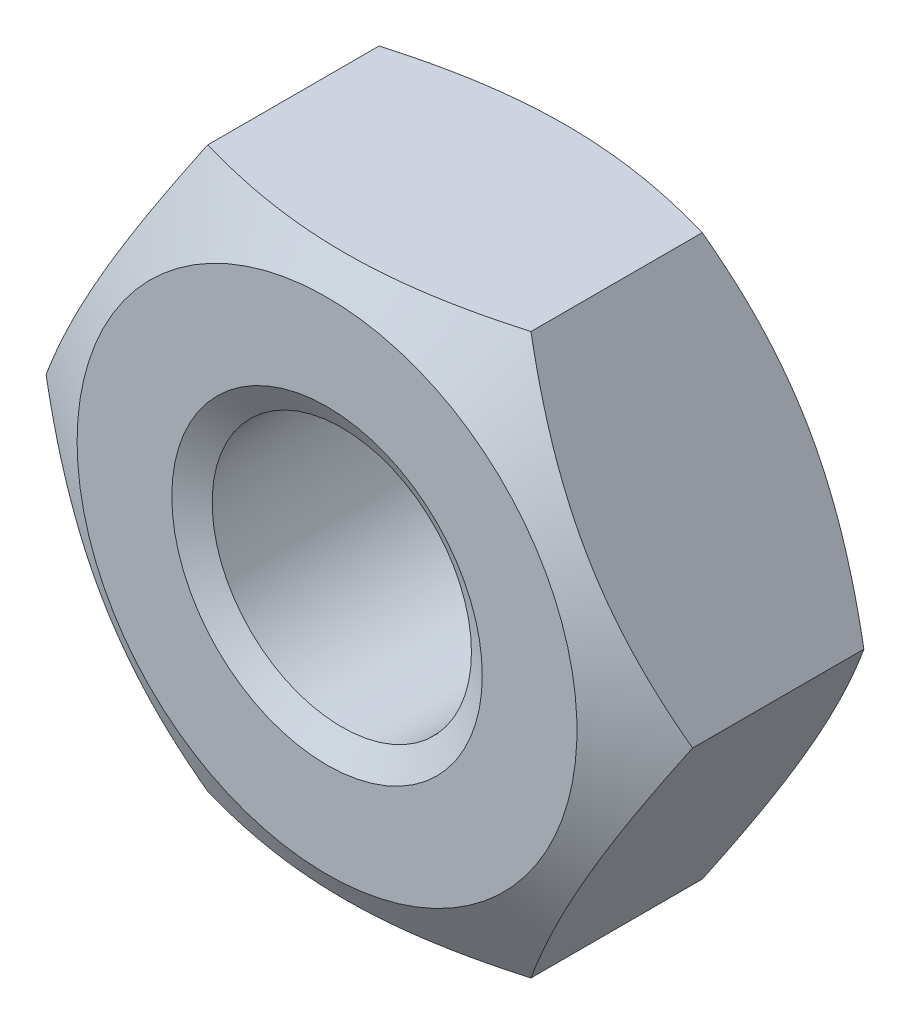
ISO-10303-21;
HEADER;
FILE_DESCRIPTION(('STEP AP214'),'2;1');
FILE_NAME('part.step','',(''),(''),'','','');
FILE_SCHEMA(('AUTOMOTIVE_DESIGN { 1 0 10303 214 1 1 1 1 }'));
ENDSEC;
DATA;
#1=APPLICATION_CONTEXT('core data for automotive mechanical design processes');
#2=APPLICATION_PROTOCOL_DEFINITION('international standard','automotive_design',2000,#1);
#3=PRODUCT_CONTEXT('',#1,'mechanical');
#4=PRODUCT('Part','Part','',(#3));
#5=PRODUCT_RELATED_PRODUCT_CATEGORY('part','',(#4));
#6=PRODUCT_DEFINITION_FORMATION('','',#4);
#7=PRODUCT_DEFINITION_CONTEXT('part definition',#1,'design');
#8=PRODUCT_DEFINITION('design','',#6,#7);
#9=PRODUCT_DEFINITION_SHAPE('','',#8);
#10=(LENGTH_UNIT() NAMED_UNIT(*) SI_UNIT(.MILLI.,.METRE.));
#11=(NAMED_UNIT(*) PLANE_ANGLE_UNIT() SI_UNIT($,.RADIAN.));
#12=(NAMED_UNIT(*) SI_UNIT($,.STERADIAN.) SOLID_ANGLE_UNIT());
#13=UNCERTAINTY_MEASURE_WITH_UNIT(LENGTH_MEASURE(1.E-05),#10,'distance_accuracy_value','');
#14=(GEOMETRIC_REPRESENTATION_CONTEXT(3) GLOBAL_UNCERTAINTY_ASSIGNED_CONTEXT((#13)) GLOBAL_UNIT_ASSIGNED_CONTEXT((#10,
#11,#12)) REPRESENTATION_CONTEXT('',''));
#15=CARTESIAN_POINT('',(0.,0.,0.));
#16=DIRECTION('',(0.,0.,1.));
#17=DIRECTION('',(1.,0.,0.));
#18=AXIS2_PLACEMENT_3D('',#15,#16,#17);
#19=CARTESIAN_POINT('',(-2.02072594216369,-3.5,-3.2));
#20=DIRECTION('',(0.,-1.,0.));
#21=DIRECTION('',(1.,0.,0.));
#22=AXIS2_PLACEMENT_3D('',#19,#20,#21);
#23=PLANE('',#22);
#24=CARTESIAN_POINT('',(-5.32929161655628,-3.5,-1.8768739570955));
#25=CARTESIAN_POINT('',(-5.17721390420334,-3.5,-1.80350487566599));
#26=CARTESIAN_POINT('',(-5.02477626879487,-3.5,-1.73086848507037));
#27=CARTESIAN_POINT('',(-4.71898932742077,-3.5,-1.58747532668502));
#28=CARTESIAN_POINT('',(-4.56563987276602,-3.5,-1.51671887634777));
#29=CARTESIAN_POINT('',(-4.25699896894404,-3.5,-1.37712246688914));
#30=CARTESIAN_POINT('',(-4.10170141818151,-3.5,-1.30829594938202));
#31=CARTESIAN_POINT('',(-3.78983593685733,-3.5,-1.17359495846471));
#32=CARTESIAN_POINT('',(-3.63326806987865,-3.5,-1.10772033836705));
#33=CARTESIAN_POINT('',(-3.31397317951131,-3.5,-0.977818284437842));
#34=CARTESIAN_POINT('',(-3.1512005381073,-3.5,-0.913902341262369));
#35=CARTESIAN_POINT('',(-2.82371486392436,-3.5,-0.791151177582951));
#36=CARTESIAN_POINT('',(-2.65900161073986,-3.5,-0.732316540636332));
#37=CARTESIAN_POINT('',(-2.32771428220931,-3.5,-0.62134515271391));
#38=CARTESIAN_POINT('',(-2.16114510129307,-3.5,-0.569193942659973));
#39=CARTESIAN_POINT('',(-1.82562056549125,-3.5,-0.473327366021486));
#40=CARTESIAN_POINT('',(-1.65666601191669,-3.5,-0.429609235647394));
#41=CARTESIAN_POINT('',(-1.31718369019254,-3.5,-0.352994778610296));
#42=CARTESIAN_POINT('',(-1.14666839877724,-3.5,-0.320044212866426));
#43=CARTESIAN_POINT('',(-0.803625193117589,-3.5,-0.266896804968947));
#44=CARTESIAN_POINT('',(-0.631097439623654,-3.5,-0.246698951170158));
#45=CARTESIAN_POINT('',(-0.287101025715154,-3.5,-0.220933629161962));
#46=CARTESIAN_POINT('',(-0.115646203356578,-3.5,-0.215185920399811));
#47=CARTESIAN_POINT('',(0.227139625224392,-3.5,-0.218339385870685));
#48=CARTESIAN_POINT('',(0.398470626774734,-3.5,-0.227241086660207));
#49=CARTESIAN_POINT('',(0.6923494546766,-3.5,-0.254460230237843));
#50=CARTESIAN_POINT('',(0.815219779631848,-3.5,-0.269472731532174));
#51=CARTESIAN_POINT('',(1.05998960024822,-3.5,-0.306041966481693));
#52=CARTESIAN_POINT('',(1.181888948341,-3.5,-0.327599676107725));
#53=CARTESIAN_POINT('',(1.54600794184171,-3.5,-0.400949728850132));
#54=CARTESIAN_POINT('',(1.78649842941779,-3.5,-0.461403324212362));
#55=CARTESIAN_POINT('',(2.14599672794727,-3.5,-0.565325828459473));
#56=CARTESIAN_POINT('',(2.26688905462246,-3.5,-0.602639268073536));
#57=CARTESIAN_POINT('',(2.50749825221244,-3.5,-0.680914127692014));
#58=CARTESIAN_POINT('',(2.62721511557209,-3.5,-0.72187557112648));
#59=CARTESIAN_POINT('',(2.86551603326948,-3.5,-0.806808159348505));
#60=CARTESIAN_POINT('',(2.98410049565285,-3.5,-0.850778169512184));
#61=CARTESIAN_POINT('',(3.22030222158571,-3.5,-0.941233650124732));
#62=CARTESIAN_POINT('',(3.33791949412912,-3.5,-0.987719097152017));
#63=CARTESIAN_POINT('',(3.60516917077565,-3.5,-1.09611499692003));
#64=CARTESIAN_POINT('',(3.75452937338733,-3.5,-1.15869521360889));
#65=CARTESIAN_POINT('',(4.05207329900666,-3.5,-1.28659848231524));
#66=CARTESIAN_POINT('',(4.20025696631961,-3.5,-1.3519216632692));
#67=CARTESIAN_POINT('',(4.64337511468222,-3.5,-1.55119395906001));
#68=CARTESIAN_POINT('',(4.93683132148516,-3.5,-1.68842699826924));
#69=CARTESIAN_POINT('',(5.52118834964412,-3.5,-1.96881056529861));
#70=CARTESIAN_POINT('',(5.81208673093574,-3.5,-2.11196612775869));
#71=CARTESIAN_POINT('',(6.39186182500917,-3.5,-2.40232740635005));
#72=CARTESIAN_POINT('',(6.6807384726872,-3.5,-2.54953325216252));
#73=CARTESIAN_POINT('',(7.23458971233424,-3.5,-2.83528891127492));
#74=CARTESIAN_POINT('',(7.49967651841012,-3.5,-2.97362193480413));
#75=CARTESIAN_POINT('',(8.02887233479629,-3.5,-3.25216194114886));
#76=CARTESIAN_POINT('',(8.29298131706612,-3.5,-3.39236897718082));
#77=CARTESIAN_POINT('',(8.81986478761872,-3.5,-3.67392059383067));
#78=CARTESIAN_POINT('',(9.082640922202,-3.5,-3.81526209803769));
#79=CARTESIAN_POINT('',(9.60756200305391,-3.5,-4.09908318288939));
#80=CARTESIAN_POINT('',(9.86970697870069,-3.5,-4.2415627091763));
#81=CARTESIAN_POINT('',(10.1316166656573,-3.5,-4.38447053028153));
#82=B_SPLINE_CURVE_WITH_KNOTS('',3,(#24,#25,#26,#27,#28,#29,#30,#31,#32,#33,#34,#35,#36,#37,#38,
#39,#40,#41,#42,#43,#44,#45,#46,#47,#48,#49,#50,#51,#52,#53,#54,#55,#56,#57,#58,#59,#60,#61,#62,
#63,#64,#65,#66,#67,#68,#69,#70,#71,#72,#73,#74,#75,#76,#77,#78,#79,#80,#81),.UNSPECIFIED.,.F.,
.F.,(4,2,2,2,2,2,2,2,2,2,2,2,2,2,2,2,2,2,2,2,2,2,2,2,2,2,2,2,4),(0.,0.506559628514695,
1.0132042594806,1.52277737705624,2.03232514447318,2.55687533860672,3.08148569427768,
3.60494121555669,4.12822489118331,4.64883048979078,5.16939478468659,5.68343298490769,
6.19748966205548,6.56865983363451,6.93988537844331,7.6827872097227,8.06231738596215,
8.44184999998748,8.82124026111235,9.20062699028891,9.68641258911835,10.1722210485271,
11.1439854050423,12.1165935361164,13.0892328442916,13.986254382644,14.8833014481238,
15.7784288466623,16.6735137420071),.UNSPECIFIED.);
#83=CARTESIAN_POINT('',(-2.02072594216369,-3.5,-0.529113742115746));
#84=VERTEX_POINT('',#83);
#85=CARTESIAN_POINT('',(2.02072594216369,-3.5,-0.529113742115746));
#86=VERTEX_POINT('',#85);
#87=EDGE_CURVE('E50',#84,#86,#82,.T.);
#88=ORIENTED_EDGE('',*,*,#87,.F.);
#89=DIRECTION('',(0.,0.,1.));
#90=VECTOR('',#89,1.);
#91=CARTESIAN_POINT('',(-2.02072594216369,-3.5,-3.2));
#92=LINE('',#91,#90);
#93=CARTESIAN_POINT('',(-2.02072594216369,-3.5,-2.67088625788425));
#94=VERTEX_POINT('',#93);
#95=EDGE_CURVE('E105',#94,#84,#92,.T.);
#96=ORIENTED_EDGE('',*,*,#95,.F.);
#97=CARTESIAN_POINT('',(-5.32929161655628,-3.5,-1.3231260429045));
#98=CARTESIAN_POINT('',(-5.17721390420334,-3.5,-1.39649512433401));
#99=CARTESIAN_POINT('',(-5.02477626879487,-3.5,-1.46913151492963));
#100=CARTESIAN_POINT('',(-4.71898932742077,-3.5,-1.61252467331498));
#101=CARTESIAN_POINT('',(-4.56563987276602,-3.5,-1.68328112365223));
#102=CARTESIAN_POINT('',(-4.25699896894404,-3.5,-1.82287753311086));
#103=CARTESIAN_POINT('',(-4.10170141818151,-3.5,-1.89170405061798));
#104=CARTESIAN_POINT('',(-3.78983593685733,-3.5,-2.02640504153529));
#105=CARTESIAN_POINT('',(-3.63326806987865,-3.5,-2.09227966163295));
#106=CARTESIAN_POINT('',(-3.31397317951131,-3.5,-2.22218171556216));
#107=CARTESIAN_POINT('',(-3.1512005381073,-3.5,-2.28609765873763));
#108=CARTESIAN_POINT('',(-2.82371486392436,-3.5,-2.40884882241705));
#109=CARTESIAN_POINT('',(-2.65900161073986,-3.5,-2.46768345936367));
#110=CARTESIAN_POINT('',(-2.32771428220931,-3.5,-2.57865484728609));
#111=CARTESIAN_POINT('',(-2.16114510129307,-3.5,-2.63080605734003));
#112=CARTESIAN_POINT('',(-1.82562056549125,-3.5,-2.72667263397851));
#113=CARTESIAN_POINT('',(-1.65666601191669,-3.5,-2.77039076435261));
#114=CARTESIAN_POINT('',(-1.31718369019254,-3.5,-2.8470052213897));
#115=CARTESIAN_POINT('',(-1.14666839877724,-3.5,-2.87995578713357));
#116=CARTESIAN_POINT('',(-0.803625193117589,-3.5,-2.93310319503105));
#117=CARTESIAN_POINT('',(-0.631097439623654,-3.5,-2.95330104882984));
#118=CARTESIAN_POINT('',(-0.287101025715154,-3.5,-2.97906637083804));
#119=CARTESIAN_POINT('',(-0.115646203356579,-3.5,-2.98481407960019));
#120=CARTESIAN_POINT('',(0.227139625224391,-3.5,-2.98166061412932));
#121=CARTESIAN_POINT('',(0.398470626774734,-3.5,-2.97275891333979));
#122=CARTESIAN_POINT('',(0.6923494546766,-3.5,-2.94553976976216));
#123=CARTESIAN_POINT('',(0.815219779631848,-3.5,-2.93052726846783));
#124=CARTESIAN_POINT('',(1.05998960024822,-3.5,-2.89395803351831));
#125=CARTESIAN_POINT('',(1.181888948341,-3.5,-2.87240032389228));
#126=CARTESIAN_POINT('',(1.54600794184171,-3.5,-2.79905027114987));
#127=CARTESIAN_POINT('',(1.78649842941779,-3.5,-2.73859667578764));
#128=CARTESIAN_POINT('',(2.14599672794727,-3.5,-2.63467417154053));
#129=CARTESIAN_POINT('',(2.26688905462246,-3.5,-2.59736073192646));
#130=CARTESIAN_POINT('',(2.50749825221244,-3.5,-2.51908587230798));
#131=CARTESIAN_POINT('',(2.62721511557209,-3.5,-2.47812442887352));
#132=CARTESIAN_POINT('',(2.86551603326949,-3.5,-2.39319184065149));
#133=CARTESIAN_POINT('',(2.98410049565285,-3.5,-2.34922183048782));
#134=CARTESIAN_POINT('',(3.22030222158572,-3.5,-2.25876634987527));
#135=CARTESIAN_POINT('',(3.33791949412912,-3.5,-2.21228090284798));
#136=CARTESIAN_POINT('',(3.60516917077565,-3.5,-2.10388500307997));
#137=CARTESIAN_POINT('',(3.75452937338733,-3.5,-2.04130478639111));
#138=CARTESIAN_POINT('',(4.05207329900666,-3.5,-1.91340151768476));
#139=CARTESIAN_POINT('',(4.20025696631961,-3.5,-1.8480783367308));
#140=CARTESIAN_POINT('',(4.64337511468222,-3.5,-1.64880604093999));
#141=CARTESIAN_POINT('',(4.93683132148516,-3.5,-1.51157300173076));
#142=CARTESIAN_POINT('',(5.52118834964412,-3.5,-1.23118943470139));
#143=CARTESIAN_POINT('',(5.81208673093574,-3.5,-1.08803387224131));
#144=CARTESIAN_POINT('',(6.39186182500917,-3.5,-0.797672593649949));
#145=CARTESIAN_POINT('',(6.6807384726872,-3.5,-0.650466747837481));
#146=CARTESIAN_POINT('',(7.23458971233423,-3.5,-0.364711088725084));
#147=CARTESIAN_POINT('',(7.49967651841012,-3.5,-0.22637806519587));
#148=CARTESIAN_POINT('',(8.02887233479628,-3.5,0.0521619411488529));
#149=CARTESIAN_POINT('',(8.29298131706612,-3.5,0.192368977180816));
#150=CARTESIAN_POINT('',(8.81986478761872,-3.5,0.473920593830667));
#151=CARTESIAN_POINT('',(9.082640922202,-3.5,0.615262098037689));
#152=CARTESIAN_POINT('',(9.60756200305391,-3.5,0.899083182889394));
#153=CARTESIAN_POINT('',(9.86970697870069,-3.5,1.0415627091763));
#154=CARTESIAN_POINT('',(10.1316166656573,-3.5,1.18447053028153));
#155=B_SPLINE_CURVE_WITH_KNOTS('',3,(#97,#98,#99,#100,#101,#102,#103,#104,#105,#106,#107,#108,
#109,#110,#111,#112,#113,#114,#115,#116,#117,#118,#119,#120,#121,#122,#123,#124,#125,#126,#127,
#128,#129,#130,#131,#132,#133,#134,#135,#136,#137,#138,#139,#140,#141,#142,#143,#144,#145,#146,
#147,#148,#149,#150,#151,#152,#153,#154),.UNSPECIFIED.,.F.,.F.,(4,2,2,2,2,2,2,2,2,2,2,2,2,2,2,2,
2,2,2,2,2,2,2,2,2,2,2,2,4),(0.,0.506559628514696,1.0132042594806,1.52277737705624,
2.03232514447318,2.55687533860672,3.08148569427768,3.60494121555669,4.12822489118331,
4.64883048979078,5.16939478468658,5.68343298490769,6.19748966205548,6.56865983363451,
6.93988537844331,7.6827872097227,8.06231738596215,8.44184999998749,8.82124026111236,
9.20062699028891,9.68641258911835,10.1722210485271,11.1439854050423,12.1165935361164,
13.0892328442916,13.986254382644,14.8833014481238,15.7784288466623,16.6735137420071),.UNSPECIFIED.);
#156=CARTESIAN_POINT('',(2.02072594216369,-3.5,-2.67088625788425));
#157=VERTEX_POINT('',#156);
#158=EDGE_CURVE('E126',#157,#94,#155,.F.);
#159=ORIENTED_EDGE('',*,*,#158,.F.);
#160=DIRECTION('',(0.,0.,1.));
#161=VECTOR('',#160,1.);
#162=CARTESIAN_POINT('',(2.02072594216369,-3.5,-3.2));
#163=LINE('',#162,#161);
#164=EDGE_CURVE('E123',#157,#86,#163,.T.);
#165=ORIENTED_EDGE('',*,*,#164,.T.);
#166=EDGE_LOOP('',(#88,#96,#159,#165));
#167=FACE_BOUND('',#166,.T.);
#168=ADVANCED_FACE('F35',(#167),#23,.T.);
#169=CARTESIAN_POINT('',(-4.04145188432738,0.,-3.2));
#170=DIRECTION('',(-0.866025403784439,-0.5,0.));
#171=DIRECTION('',(0.5,-0.866025403784439,0.));
#172=AXIS2_PLACEMENT_3D('',#169,#170,#171);
#173=PLANE('',#172);
#174=CARTESIAN_POINT('',(-4.04156735438122,0.000200000000000874,-0.529180411639474));
#175=CARTESIAN_POINT('',(-3.9527667384984,-0.153607178452448,-0.477892139936087));
#176=CARTESIAN_POINT('',(-3.86319960126198,-0.308742010834423,-0.431247304762301));
#177=CARTESIAN_POINT('',(-3.68251437287562,-0.621698006576779,-0.349828226479454));
#178=CARTESIAN_POINT('',(-3.59139307116725,-0.779524730787494,-0.315082786530667));
#179=CARTESIAN_POINT('',(-3.41027974688034,-1.09322221038012,-0.260996378128942));
#180=CARTESIAN_POINT('',(-3.32031559103708,-1.24904469916069,-0.241295437206488));
#181=CARTESIAN_POINT('',(-3.13996396008052,-1.56142288720537,-0.21777648368336));
#182=CARTESIAN_POINT('',(-3.04957714051106,-1.71797745103423,-0.213938995491671));
#183=CARTESIAN_POINT('',(-2.88068384499777,-2.01050921992099,-0.221921652823084));
#184=CARTESIAN_POINT('',(-2.80215208834115,-2.1465302124579,-0.231781785015713));
#185=CARTESIAN_POINT('',(-2.64560020969754,-2.41768602028899,-0.263032817845509));
#186=CARTESIAN_POINT('',(-2.5675806292065,-2.55281989768468,-0.284434394231903));
#187=CARTESIAN_POINT('',(-2.41070596159678,-2.82453479240518,-0.337936758826681));
#188=CARTESIAN_POINT('',(-2.33187072981463,-2.96108141927833,-0.370264345391191));
#189=CARTESIAN_POINT('',(-2.17537608630783,-3.2321380929445,-0.443635284754097));
#190=CARTESIAN_POINT('',(-2.09771466960098,-3.36665161246854,-0.484661397515969));
#191=CARTESIAN_POINT('',(-2.02061047210985,-3.5002,-0.529180411639473));
#192=B_SPLINE_CURVE_WITH_KNOTS('',3,(#174,#175,#176,#177,#178,#179,#180,#181,#182,#183,#184,
#185,#186,#187,#188,#189,#190,#191),.UNSPECIFIED.,.F.,.F.,(4,2,2,2,2,2,2,2,4),(0.,
0.554793832886252,1.11092123814983,1.65328467083218,2.19498204478403,2.6666513085086,
3.13875761298267,3.6213361260051,4.10296698719187),.UNSPECIFIED.);
#193=CARTESIAN_POINT('',(-4.04145188432738,0.,-0.529113742115746));
#194=VERTEX_POINT('',#193);
#195=EDGE_CURVE('E90',#194,#84,#192,.T.);
#196=ORIENTED_EDGE('',*,*,#195,.F.);
#197=DIRECTION('',(0.,0.,1.));
#198=VECTOR('',#197,1.);
#199=CARTESIAN_POINT('',(-4.04145188432738,0.,-3.2));
#200=LINE('',#199,#198);
#201=CARTESIAN_POINT('',(-4.04145188432738,0.,-2.67088625788425));
#202=VERTEX_POINT('',#201);
#203=EDGE_CURVE('E103',#202,#194,#200,.T.);
#204=ORIENTED_EDGE('',*,*,#203,.F.);
#205=CARTESIAN_POINT('',(-2.02061047210985,-3.5002,-2.67081958836053));
#206=CARTESIAN_POINT('',(-2.10941108799267,-3.34639282154755,-2.72210786006391));
#207=CARTESIAN_POINT('',(-2.19897822522909,-3.19125798916558,-2.7687526952377));
#208=CARTESIAN_POINT('',(-2.37966345361545,-2.87830199342322,-2.85017177352055));
#209=CARTESIAN_POINT('',(-2.47078475532382,-2.72047526921251,-2.88491721346933));
#210=CARTESIAN_POINT('',(-2.65189807961073,-2.40677778961987,-2.93900362187106));
#211=CARTESIAN_POINT('',(-2.74186223545399,-2.25095530083931,-2.95870456279351));
#212=CARTESIAN_POINT('',(-2.92221386641055,-1.93857711279463,-2.98222351631664));
#213=CARTESIAN_POINT('',(-3.01260068598001,-1.78202254896577,-2.98606100450833));
#214=CARTESIAN_POINT('',(-3.1814939814933,-1.48949078007901,-2.97807834717692));
#215=CARTESIAN_POINT('',(-3.26002573814993,-1.3534697875421,-2.96821821498429));
#216=CARTESIAN_POINT('',(-3.41657761679354,-1.08231397971101,-2.93696718215449));
#217=CARTESIAN_POINT('',(-3.49459719728457,-0.947180102315318,-2.9155656057681));
#218=CARTESIAN_POINT('',(-3.65147186489429,-0.675465207594817,-2.86206324117332));
#219=CARTESIAN_POINT('',(-3.73030709667644,-0.538918580721665,-2.82973565460881));
#220=CARTESIAN_POINT('',(-3.88680174018324,-0.267861907055498,-2.7563647152459));
#221=CARTESIAN_POINT('',(-3.96446315689009,-0.133348387531463,-2.71533860248403));
#222=CARTESIAN_POINT('',(-4.04156735438122,0.000200000000001083,-2.67081958836053));
#223=B_SPLINE_CURVE_WITH_KNOTS('',3,(#205,#206,#207,#208,#209,#210,#211,#212,#213,#214,#215,
#216,#217,#218,#219,#220,#221,#222),.UNSPECIFIED.,.F.,.F.,(4,2,2,2,2,2,2,2,4),(0.,
0.554793832886253,1.11092123814983,1.65328467083218,2.19498204478403,2.6666513085086,
3.13875761298267,3.6213361260051,4.10296698719187),.UNSPECIFIED.);
#224=EDGE_CURVE('E199',#94,#202,#223,.T.);
#225=ORIENTED_EDGE('',*,*,#224,.F.);
#226=ORIENTED_EDGE('',*,*,#95,.T.);
#227=EDGE_LOOP('',(#196,#204,#225,#226));
#228=FACE_BOUND('',#227,.T.);
#229=ADVANCED_FACE('F101',(#228),#173,.T.);
#230=CARTESIAN_POINT('',(-2.02072594216369,3.5,-3.2));
#231=DIRECTION('',(-0.866025403784438,0.5,0.));
#232=DIRECTION('',(-0.5,-0.866025403784439,0.));
#233=AXIS2_PLACEMENT_3D('',#230,#231,#232);
#234=PLANE('',#233);
#235=CARTESIAN_POINT('',(-2.02061047210985,3.5002,-0.529180411639474));
#236=CARTESIAN_POINT('',(-2.10941108799267,3.34639282154755,-0.477892139936087));
#237=CARTESIAN_POINT('',(-2.19897822522909,3.19125798916558,-0.431247304762301));
#238=CARTESIAN_POINT('',(-2.37966345361545,2.87830199342322,-0.349828226479454));
#239=CARTESIAN_POINT('',(-2.47078475532382,2.72047526921251,-0.315082786530667));
#240=CARTESIAN_POINT('',(-2.65189807961073,2.40677778961987,-0.260996378128942));
#241=CARTESIAN_POINT('',(-2.74186223545399,2.25095530083931,-0.241295437206488));
#242=CARTESIAN_POINT('',(-2.92221386641056,1.93857711279463,-0.217776483683361));
#243=CARTESIAN_POINT('',(-3.01260068598001,1.78202254896577,-0.213938995491672));
#244=CARTESIAN_POINT('',(-3.1814939814933,1.48949078007901,-0.221921652823084));
#245=CARTESIAN_POINT('',(-3.26002573814993,1.3534697875421,-0.231781785015713));
#246=CARTESIAN_POINT('',(-3.41657761679354,1.08231397971101,-0.263032817845509));
#247=CARTESIAN_POINT('',(-3.49459719728457,0.947180102315319,-0.284434394231904));
#248=CARTESIAN_POINT('',(-3.65147186489429,0.675465207594818,-0.337936758826682));
#249=CARTESIAN_POINT('',(-3.73030709667644,0.538918580721666,-0.370264345391192));
#250=CARTESIAN_POINT('',(-3.88680174018324,0.2678619070555,-0.443635284754098));
#251=CARTESIAN_POINT('',(-3.96446315689009,0.133348387531464,-0.48466139751597));
#252=CARTESIAN_POINT('',(-4.04156735438122,-0.000199999999999236,-0.529180411639474));
#253=B_SPLINE_CURVE_WITH_KNOTS('',3,(#235,#236,#237,#238,#239,#240,#241,#242,#243,#244,#245,
#246,#247,#248,#249,#250,#251,#252),.UNSPECIFIED.,.F.,.F.,(4,2,2,2,2,2,2,2,4),(0.,
0.554793832886253,1.11092123814983,1.65328467083218,2.19498204478403,2.6666513085086,
3.13875761298267,3.62133612600509,4.10296698719187),.UNSPECIFIED.);
#254=CARTESIAN_POINT('',(-2.02072594216369,3.5,-0.529113742115746));
#255=VERTEX_POINT('',#254);
#256=EDGE_CURVE('E86',#255,#194,#253,.T.);
#257=ORIENTED_EDGE('',*,*,#256,.F.);
#258=DIRECTION('',(0.,0.,1.));
#259=VECTOR('',#258,1.);
#260=CARTESIAN_POINT('',(-2.02072594216369,3.5,-3.2));
#261=LINE('',#260,#259);
#262=CARTESIAN_POINT('',(-2.02072594216369,3.5,-2.67088625788425));
#263=VERTEX_POINT('',#262);
#264=EDGE_CURVE('E110',#263,#255,#261,.T.);
#265=ORIENTED_EDGE('',*,*,#264,.F.);
#266=CARTESIAN_POINT('',(-4.04156735438122,-0.000199999999999165,-2.67081958836053));
#267=CARTESIAN_POINT('',(-3.9527667384984,0.15360717845245,-2.72210786006391));
#268=CARTESIAN_POINT('',(-3.86319960126198,0.308742010834425,-2.7687526952377));
#269=CARTESIAN_POINT('',(-3.68251437287562,0.621698006576781,-2.85017177352055));
#270=CARTESIAN_POINT('',(-3.59139307116725,0.779524730787496,-2.88491721346933));
#271=CARTESIAN_POINT('',(-3.41027974688034,1.09322221038013,-2.93900362187106));
#272=CARTESIAN_POINT('',(-3.32031559103708,1.24904469916069,-2.95870456279351));
#273=CARTESIAN_POINT('',(-3.13996396008052,1.56142288720537,-2.98222351631664));
#274=CARTESIAN_POINT('',(-3.04957714051106,1.71797745103423,-2.98606100450833));
#275=CARTESIAN_POINT('',(-2.88068384499777,2.01050921992099,-2.97807834717692));
#276=CARTESIAN_POINT('',(-2.80215208834115,2.14653021245791,-2.96821821498429));
#277=CARTESIAN_POINT('',(-2.64560020969754,2.41768602028899,-2.93696718215449));
#278=CARTESIAN_POINT('',(-2.5675806292065,2.55281989768468,-2.9155656057681));
#279=CARTESIAN_POINT('',(-2.41070596159678,2.82453479240518,-2.86206324117332));
#280=CARTESIAN_POINT('',(-2.33187072981463,2.96108141927834,-2.82973565460881));
#281=CARTESIAN_POINT('',(-2.17537608630783,3.2321380929445,-2.7563647152459));
#282=CARTESIAN_POINT('',(-2.09771466960098,3.36665161246854,-2.71533860248403));
#283=CARTESIAN_POINT('',(-2.02061047210985,3.5002,-2.67081958836053));
#284=B_SPLINE_CURVE_WITH_KNOTS('',3,(#266,#267,#268,#269,#270,#271,#272,#273,#274,#275,#276,
#277,#278,#279,#280,#281,#282,#283),.UNSPECIFIED.,.F.,.F.,(4,2,2,2,2,2,2,2,4),(0.,
0.554793832886253,1.11092123814983,1.65328467083218,2.19498204478403,2.6666513085086,
3.13875761298267,3.62133612600509,4.10296698719187),.UNSPECIFIED.);
#285=EDGE_CURVE('E109',#202,#263,#284,.T.);
#286=ORIENTED_EDGE('',*,*,#285,.F.);
#287=ORIENTED_EDGE('',*,*,#203,.T.);
#288=EDGE_LOOP('',(#257,#265,#286,#287));
#289=FACE_BOUND('',#288,.T.);
#290=ADVANCED_FACE('F108',(#289),#234,.T.);
#291=CARTESIAN_POINT('',(2.02072594216369,3.5,-3.2));
#292=DIRECTION('',(0.,1.,0.));
#293=DIRECTION('',(0.,0.,1.));
#294=AXIS2_PLACEMENT_3D('',#291,#292,#293);
#295=PLANE('',#294);
#296=CARTESIAN_POINT('',(-5.32929161654317,3.5,-1.87687395708917));
#297=CARTESIAN_POINT('',(-5.17721390419067,3.5,-1.80350487565994));
#298=CARTESIAN_POINT('',(-5.02477626878264,3.5,-1.73086848506458));
#299=CARTESIAN_POINT('',(-4.71898932740942,3.5,-1.58747532667976));
#300=CARTESIAN_POINT('',(-4.56563987275511,3.5,-1.51671887634277));
#301=CARTESIAN_POINT('',(-4.25699896893402,3.5,-1.37712246688467));
#302=CARTESIAN_POINT('',(-4.10170141817195,3.5,-1.30829594937782));
#303=CARTESIAN_POINT('',(-3.78983593684867,3.5,-1.17359495846103));
#304=CARTESIAN_POINT('',(-3.63326806987044,3.5,-1.10772033836364));
#305=CARTESIAN_POINT('',(-3.31397317950403,3.5,-0.977818284434954));
#306=CARTESIAN_POINT('',(-3.1512005381005,3.5,-0.913902341259745));
#307=CARTESIAN_POINT('',(-2.82371486391854,3.5,-0.791151177580841));
#308=CARTESIAN_POINT('',(-2.65900161073452,3.5,-0.732316540634472));
#309=CARTESIAN_POINT('',(-2.32771428220496,3.5,-0.621345152712525));
#310=CARTESIAN_POINT('',(-2.16114510128922,3.5,-0.569193942658812));
#311=CARTESIAN_POINT('',(-1.82562056548841,3.5,-0.473327366020735));
#312=CARTESIAN_POINT('',(-1.65666601191436,3.5,-0.42960923564683));
#313=CARTESIAN_POINT('',(-1.31718369019152,3.5,-0.352994778610105));
#314=CARTESIAN_POINT('',(-1.14666839877701,3.5,-0.320044212866405));
#315=CARTESIAN_POINT('',(-0.803625193118965,3.5,-0.266896804969146));
#316=CARTESIAN_POINT('',(-0.631097439625841,3.5,-0.246698951170405));
#317=CARTESIAN_POINT('',(-0.287101025718949,3.5,-0.220933629162164));
#318=CARTESIAN_POINT('',(-0.115646203361171,3.5,-0.215185920399921));
#319=CARTESIAN_POINT('',(0.227139625218219,3.5,-0.218339385870476));
#320=CARTESIAN_POINT('',(0.39847062676778,3.5,-0.227241086659772));
#321=CARTESIAN_POINT('',(0.692349454668639,3.5,-0.254460230236955));
#322=CARTESIAN_POINT('',(0.815219779623655,3.5,-0.269472731531103));
#323=CARTESIAN_POINT('',(1.05998960023958,3.5,-0.306041966480247));
#324=CARTESIAN_POINT('',(1.18188894833212,3.5,-0.327599676106087));
#325=CARTESIAN_POINT('',(1.54600794183219,3.5,-0.400949728847913));
#326=CARTESIAN_POINT('',(1.78649842940784,3.5,-0.461403324209749));
#327=CARTESIAN_POINT('',(2.14599672793669,3.5,-0.565325828456279));
#328=CARTESIAN_POINT('',(2.26688905461166,3.5,-0.602639268070147));
#329=CARTESIAN_POINT('',(2.50749825220121,3.5,-0.68091412768824));
#330=CARTESIAN_POINT('',(2.62721511556065,3.5,-0.721875571122515));
#331=CARTESIAN_POINT('',(2.86551603325762,3.5,-0.806808159344166));
#332=CARTESIAN_POINT('',(2.98410049564078,3.5,-0.850778169507661));
#333=CARTESIAN_POINT('',(3.22030222157322,3.5,-0.941233650119847));
#334=CARTESIAN_POINT('',(3.33791949411641,3.5,-0.987719097146953));
#335=CARTESIAN_POINT('',(3.60516917076279,3.5,-1.0961149969147));
#336=CARTESIAN_POINT('',(3.75452937337452,3.5,-1.15869521360348));
#337=CARTESIAN_POINT('',(4.05207329899395,3.5,-1.28659848230968));
#338=CARTESIAN_POINT('',(4.20025696630695,3.5,-1.35192166326358));
#339=CARTESIAN_POINT('',(4.64337511466969,3.5,-1.55119395905422));
#340=CARTESIAN_POINT('',(4.93683132147272,3.5,-1.68842699826337));
#341=CARTESIAN_POINT('',(5.52118834963183,3.5,-1.96881056529261));
#342=CARTESIAN_POINT('',(5.81208673092351,3.5,-2.11196612775264));
#343=CARTESIAN_POINT('',(6.39186182499708,3.5,-2.40232740634392));
#344=CARTESIAN_POINT('',(6.68073847267516,3.5,-2.54953325215636));
#345=CARTESIAN_POINT('',(7.23458971232227,3.5,-2.83528891126869));
#346=CARTESIAN_POINT('',(7.49967651839816,3.5,-2.97362193479787));
#347=CARTESIAN_POINT('',(8.02887233478434,3.5,-3.25216194114253));
#348=CARTESIAN_POINT('',(8.29298131705417,3.5,-3.39236897717446));
#349=CARTESIAN_POINT('',(8.81986478760678,3.5,-3.67392059382426));
#350=CARTESIAN_POINT('',(9.08264092219005,3.5,-3.81526209803125));
#351=CARTESIAN_POINT('',(9.60756200304195,3.5,-4.0990831828829));
#352=CARTESIAN_POINT('',(9.86970697868872,3.5,-4.24156270916979));
#353=CARTESIAN_POINT('',(10.1316166656453,3.5,-4.384470530275));
#354=B_SPLINE_CURVE_WITH_KNOTS('',3,(#296,#297,#298,#299,#300,#301,#302,#303,#304,#305,#306,
#307,#308,#309,#310,#311,#312,#313,#314,#315,#316,#317,#318,#319,#320,#321,#322,#323,#324,#325,
#326,#327,#328,#329,#330,#331,#332,#333,#334,#335,#336,#337,#338,#339,#340,#341,#342,#343,#344,
#345,#346,#347,#348,#349,#350,#351,#352,#353),.UNSPECIFIED.,.F.,.F.,(4,2,2,2,2,2,2,2,2,2,2,2,2,
2,2,2,2,2,2,2,2,2,2,2,2,2,2,2,4),(0.,0.50655962851316,1.01320425947753,1.52277737705162,
2.03232514446701,2.55687533859891,3.08148569426823,3.60494121554562,4.12822489117061,
4.64883048977565,5.16939478466903,5.68343298488776,6.19748966203318,6.56865983361145,
6.93988537841949,7.68278720969736,8.06231738593603,8.44184999996057,8.82124026108465,
9.20062699026042,9.68641258908992,10.1722210484987,11.143985405014,12.1165935360882,
13.0892328442636,13.9862543826159,14.8833014480957,15.7784288466341,16.6735137419789),.UNSPECIFIED.);
#355=CARTESIAN_POINT('',(2.02072594216369,3.5,-0.529113742115746));
#356=VERTEX_POINT('',#355);
#357=EDGE_CURVE('E92',#356,#255,#354,.F.);
#358=ORIENTED_EDGE('',*,*,#357,.F.);
#359=DIRECTION('',(0.,0.,1.));
#360=VECTOR('',#359,1.);
#361=CARTESIAN_POINT('',(2.02072594216369,3.5,-3.2));
#362=LINE('',#361,#360);
#363=CARTESIAN_POINT('',(2.02072594216369,3.5,-2.67088625788425));
#364=VERTEX_POINT('',#363);
#365=EDGE_CURVE('E114',#364,#356,#362,.T.);
#366=ORIENTED_EDGE('',*,*,#365,.F.);
#367=CARTESIAN_POINT('',(-5.32929161654318,3.5,-1.32312604291083));
#368=CARTESIAN_POINT('',(-5.17721390419067,3.5,-1.39649512434006));
#369=CARTESIAN_POINT('',(-5.02477626878264,3.5,-1.46913151493542));
#370=CARTESIAN_POINT('',(-4.71898932740942,3.5,-1.61252467332024));
#371=CARTESIAN_POINT('',(-4.56563987275511,3.5,-1.68328112365723));
#372=CARTESIAN_POINT('',(-4.25699896893402,3.5,-1.82287753311533));
#373=CARTESIAN_POINT('',(-4.10170141817195,3.5,-1.89170405062218));
#374=CARTESIAN_POINT('',(-3.78983593684866,3.5,-2.02640504153897));
#375=CARTESIAN_POINT('',(-3.63326806987044,3.5,-2.09227966163636));
#376=CARTESIAN_POINT('',(-3.31397317950403,3.5,-2.22218171556505));
#377=CARTESIAN_POINT('',(-3.1512005381005,3.5,-2.28609765874026));
#378=CARTESIAN_POINT('',(-2.82371486391853,3.5,-2.40884882241916));
#379=CARTESIAN_POINT('',(-2.65900161073452,3.5,-2.46768345936553));
#380=CARTESIAN_POINT('',(-2.32771428220496,3.5,-2.57865484728748));
#381=CARTESIAN_POINT('',(-2.16114510128922,3.5,-2.63080605734119));
#382=CARTESIAN_POINT('',(-1.82562056548841,3.5,-2.72667263397926));
#383=CARTESIAN_POINT('',(-1.65666601191436,3.5,-2.77039076435317));
#384=CARTESIAN_POINT('',(-1.31718369019152,3.5,-2.8470052213899));
#385=CARTESIAN_POINT('',(-1.14666839877701,3.5,-2.8799557871336));
#386=CARTESIAN_POINT('',(-0.803625193118965,3.5,-2.93310319503085));
#387=CARTESIAN_POINT('',(-0.631097439625841,3.5,-2.95330104882959));
#388=CARTESIAN_POINT('',(-0.287101025718949,3.5,-2.97906637083784));
#389=CARTESIAN_POINT('',(-0.115646203361171,3.5,-2.98481407960008));
#390=CARTESIAN_POINT('',(0.22713962521822,3.5,-2.98166061412952));
#391=CARTESIAN_POINT('',(0.39847062676778,3.5,-2.97275891334023));
#392=CARTESIAN_POINT('',(0.692349454668639,3.5,-2.94553976976304));
#393=CARTESIAN_POINT('',(0.815219779623655,3.5,-2.9305272684689));
#394=CARTESIAN_POINT('',(1.05998960023958,3.5,-2.89395803351975));
#395=CARTESIAN_POINT('',(1.18188894833212,3.5,-2.87240032389391));
#396=CARTESIAN_POINT('',(1.54600794183219,3.5,-2.79905027115209));
#397=CARTESIAN_POINT('',(1.78649842940784,3.5,-2.73859667579025));
#398=CARTESIAN_POINT('',(2.14599672793669,3.5,-2.63467417154372));
#399=CARTESIAN_POINT('',(2.26688905461166,3.5,-2.59736073192985));
#400=CARTESIAN_POINT('',(2.50749825220121,3.5,-2.51908587231176));
#401=CARTESIAN_POINT('',(2.62721511556065,3.5,-2.47812442887748));
#402=CARTESIAN_POINT('',(2.86551603325762,3.5,-2.39319184065583));
#403=CARTESIAN_POINT('',(2.98410049564078,3.5,-2.34922183049234));
#404=CARTESIAN_POINT('',(3.22030222157322,3.5,-2.25876634988015));
#405=CARTESIAN_POINT('',(3.33791949411641,3.5,-2.21228090285305));
#406=CARTESIAN_POINT('',(3.60516917076279,3.5,-2.1038850030853));
#407=CARTESIAN_POINT('',(3.75452937337452,3.5,-2.04130478639652));
#408=CARTESIAN_POINT('',(4.05207329899395,3.5,-1.91340151769032));
#409=CARTESIAN_POINT('',(4.20025696630695,3.5,-1.84807833673642));
#410=CARTESIAN_POINT('',(4.64337511466969,3.5,-1.64880604094578));
#411=CARTESIAN_POINT('',(4.93683132147272,3.5,-1.51157300173663));
#412=CARTESIAN_POINT('',(5.52118834963183,3.5,-1.23118943470739));
#413=CARTESIAN_POINT('',(5.81208673092351,3.5,-1.08803387224736));
#414=CARTESIAN_POINT('',(6.39186182499708,3.5,-0.797672593656078));
#415=CARTESIAN_POINT('',(6.68073847267516,3.5,-0.650466747843639));
#416=CARTESIAN_POINT('',(7.23458971232227,3.5,-0.364711088731305));
#417=CARTESIAN_POINT('',(7.49967651839816,3.5,-0.226378065202126));
#418=CARTESIAN_POINT('',(8.02887233478434,3.5,0.0521619411425306));
#419=CARTESIAN_POINT('',(8.29298131705417,3.5,0.192368977174463));
#420=CARTESIAN_POINT('',(8.81986478760678,3.5,0.473920593824257));
#421=CARTESIAN_POINT('',(9.08264092219006,3.5,0.615262098031252));
#422=CARTESIAN_POINT('',(9.60756200304195,3.5,0.899083182882906));
#423=CARTESIAN_POINT('',(9.86970697868872,3.5,1.04156270916979));
#424=CARTESIAN_POINT('',(10.1316166656453,3.5,1.184470530275));
#425=B_SPLINE_CURVE_WITH_KNOTS('',3,(#367,#368,#369,#370,#371,#372,#373,#374,#375,#376,#377,
#378,#379,#380,#381,#382,#383,#384,#385,#386,#387,#388,#389,#390,#391,#392,#393,#394,#395,#396,
#397,#398,#399,#400,#401,#402,#403,#404,#405,#406,#407,#408,#409,#410,#411,#412,#413,#414,#415,
#416,#417,#418,#419,#420,#421,#422,#423,#424),.UNSPECIFIED.,.F.,.F.,(4,2,2,2,2,2,2,2,2,2,2,2,2,
2,2,2,2,2,2,2,2,2,2,2,2,2,2,2,4),(0.,0.506559628513161,1.01320425947753,1.52277737705162,
2.03232514446701,2.55687533859891,3.08148569426824,3.60494121554562,4.12822489117061,
4.64883048977565,5.16939478466903,5.68343298488777,6.19748966203318,6.56865983361145,
6.9398853784195,7.68278720969737,8.06231738593603,8.44184999996057,8.82124026108466,
9.20062699026042,9.68641258908992,10.1722210484987,11.143985405014,12.1165935360882,
13.0892328442636,13.986254382616,14.8833014480957,15.7784288466341,16.673513741979),.UNSPECIFIED.);
#426=EDGE_CURVE('E186',#263,#364,#425,.T.);
#427=ORIENTED_EDGE('',*,*,#426,.F.);
#428=ORIENTED_EDGE('',*,*,#264,.T.);
#429=EDGE_LOOP('',(#358,#366,#427,#428));
#430=FACE_BOUND('',#429,.T.);
#431=ADVANCED_FACE('F234',(#430),#295,.T.);
#432=CARTESIAN_POINT('',(4.04145188432738,0.,-3.2));
#433=DIRECTION('',(0.866025403784438,0.5,0.));
#434=DIRECTION('',(-0.5,0.866025403784438,0.));
#435=AXIS2_PLACEMENT_3D('',#432,#433,#434);
#436=PLANE('',#435);
#437=CARTESIAN_POINT('',(4.04156735438122,-0.000199999999998962,-0.529180411639473));
#438=CARTESIAN_POINT('',(3.9527667384984,0.153607178452451,-0.477892139936087));
#439=CARTESIAN_POINT('',(3.86319960126198,0.308742010834425,-0.431247304762301));
#440=CARTESIAN_POINT('',(3.68251437287562,0.621698006576781,-0.349828226479453));
#441=CARTESIAN_POINT('',(3.59139307116725,0.779524730787496,-0.315082786530667));
#442=CARTESIAN_POINT('',(3.41027974688034,1.09322221038013,-0.260996378128942));
#443=CARTESIAN_POINT('',(3.32031559103708,1.24904469916069,-0.241295437206487));
#444=CARTESIAN_POINT('',(3.13996396008052,1.56142288720537,-0.21777648368336));
#445=CARTESIAN_POINT('',(3.04957714051106,1.71797745103423,-0.213938995491671));
#446=CARTESIAN_POINT('',(2.88068384499777,2.01050921992099,-0.221921652823083));
#447=CARTESIAN_POINT('',(2.80215208834114,2.1465302124579,-0.231781785015712));
#448=CARTESIAN_POINT('',(2.64560020969753,2.41768602028899,-0.263032817845508));
#449=CARTESIAN_POINT('',(2.5675806292065,2.55281989768468,-0.284434394231903));
#450=CARTESIAN_POINT('',(2.41070596159678,2.82453479240518,-0.337936758826681));
#451=CARTESIAN_POINT('',(2.33187072981463,2.96108141927833,-0.370264345391191));
#452=CARTESIAN_POINT('',(2.17537608630783,3.2321380929445,-0.443635284754097));
#453=CARTESIAN_POINT('',(2.09771466960098,3.36665161246854,-0.484661397515969));
#454=CARTESIAN_POINT('',(2.02061047210985,3.5002,-0.529180411639473));
#455=B_SPLINE_CURVE_WITH_KNOTS('',3,(#437,#438,#439,#440,#441,#442,#443,#444,#445,#446,#447,
#448,#449,#450,#451,#452,#453,#454),.UNSPECIFIED.,.F.,.F.,(4,2,2,2,2,2,2,2,4),(0.,
0.554793832886253,1.11092123814983,1.65328467083218,2.19498204478403,2.6666513085086,
3.13875761298267,3.62133612600509,4.10296698719187),.UNSPECIFIED.);
#456=CARTESIAN_POINT('',(4.04145188432738,0.,-0.529113742115746));
#457=VERTEX_POINT('',#456);
#458=EDGE_CURVE('E228',#457,#356,#455,.T.);
#459=ORIENTED_EDGE('',*,*,#458,.F.);
#460=DIRECTION('',(0.,0.,1.));
#461=VECTOR('',#460,1.);
#462=CARTESIAN_POINT('',(4.04145188432738,0.,-3.2));
#463=LINE('',#462,#461);
#464=CARTESIAN_POINT('',(4.04145188432738,0.,-2.67088625788425));
#465=VERTEX_POINT('',#464);
#466=EDGE_CURVE('E120',#465,#457,#463,.T.);
#467=ORIENTED_EDGE('',*,*,#466,.F.);
#468=CARTESIAN_POINT('',(2.02061047210985,3.5002,-2.67081958836053));
#469=CARTESIAN_POINT('',(2.10941108799267,3.34639282154755,-2.72210786006391));
#470=CARTESIAN_POINT('',(2.19897822522909,3.19125798916558,-2.7687526952377));
#471=CARTESIAN_POINT('',(2.37966345361545,2.87830199342322,-2.85017177352055));
#472=CARTESIAN_POINT('',(2.47078475532382,2.72047526921251,-2.88491721346933));
#473=CARTESIAN_POINT('',(2.65189807961073,2.40677778961987,-2.93900362187106));
#474=CARTESIAN_POINT('',(2.74186223545399,2.25095530083931,-2.95870456279351));
#475=CARTESIAN_POINT('',(2.92221386641055,1.93857711279463,-2.98222351631664));
#476=CARTESIAN_POINT('',(3.01260068598001,1.78202254896577,-2.98606100450833));
#477=CARTESIAN_POINT('',(3.1814939814933,1.48949078007901,-2.97807834717692));
#478=CARTESIAN_POINT('',(3.26002573814992,1.3534697875421,-2.96821821498429));
#479=CARTESIAN_POINT('',(3.41657761679353,1.08231397971101,-2.93696718215449));
#480=CARTESIAN_POINT('',(3.49459719728457,0.947180102315319,-2.9155656057681));
#481=CARTESIAN_POINT('',(3.65147186489429,0.675465207594818,-2.86206324117332));
#482=CARTESIAN_POINT('',(3.73030709667644,0.538918580721666,-2.82973565460881));
#483=CARTESIAN_POINT('',(3.88680174018324,0.2678619070555,-2.7563647152459));
#484=CARTESIAN_POINT('',(3.96446315689009,0.133348387531465,-2.71533860248403));
#485=CARTESIAN_POINT('',(4.04156735438122,-0.00019999999999903,-2.67081958836053));
#486=B_SPLINE_CURVE_WITH_KNOTS('',3,(#468,#469,#470,#471,#472,#473,#474,#475,#476,#477,#478,
#479,#480,#481,#482,#483,#484,#485),.UNSPECIFIED.,.F.,.F.,(4,2,2,2,2,2,2,2,4),(0.,
0.554793832886252,1.11092123814983,1.65328467083218,2.19498204478403,2.6666513085086,
3.13875761298267,3.62133612600509,4.10296698719187),.UNSPECIFIED.);
#487=EDGE_CURVE('E58',#364,#465,#486,.T.);
#488=ORIENTED_EDGE('',*,*,#487,.F.);
#489=ORIENTED_EDGE('',*,*,#365,.T.);
#490=EDGE_LOOP('',(#459,#467,#488,#489));
#491=FACE_BOUND('',#490,.T.);
#492=ADVANCED_FACE('F237',(#491),#436,.T.);
#493=CARTESIAN_POINT('',(2.02072594216369,-3.5,-3.2));
#494=DIRECTION('',(0.866025403784439,-0.5,0.));
#495=DIRECTION('',(0.5,0.866025403784439,0.));
#496=AXIS2_PLACEMENT_3D('',#493,#494,#495);
#497=PLANE('',#496);
#498=CARTESIAN_POINT('',(2.02061047210985,-3.5002,-0.529180411639474));
#499=CARTESIAN_POINT('',(2.10941108799267,-3.34639282154755,-0.477892139936087));
#500=CARTESIAN_POINT('',(2.19897822522909,-3.19125798916558,-0.431247304762301));
#501=CARTESIAN_POINT('',(2.37966345361545,-2.87830199342322,-0.349828226479453));
#502=CARTESIAN_POINT('',(2.47078475532382,-2.7204752692125,-0.315082786530666));
#503=CARTESIAN_POINT('',(2.65189807961073,-2.40677778961987,-0.260996378128942));
#504=CARTESIAN_POINT('',(2.74186223545399,-2.25095530083931,-0.241295437206487));
#505=CARTESIAN_POINT('',(2.92221386641055,-1.93857711279463,-0.21777648368336));
#506=CARTESIAN_POINT('',(3.01260068598001,-1.78202254896577,-0.213938995491671));
#507=CARTESIAN_POINT('',(3.1814939814933,-1.48949078007901,-0.221921652823083));
#508=CARTESIAN_POINT('',(3.26002573814993,-1.35346978754209,-0.231781785015713));
#509=CARTESIAN_POINT('',(3.41657761679354,-1.08231397971101,-0.263032817845509));
#510=CARTESIAN_POINT('',(3.49459719728457,-0.947180102315318,-0.284434394231903));
#511=CARTESIAN_POINT('',(3.65147186489429,-0.675465207594817,-0.337936758826681));
#512=CARTESIAN_POINT('',(3.73030709667644,-0.538918580721665,-0.370264345391191));
#513=CARTESIAN_POINT('',(3.88680174018324,-0.267861907055498,-0.443635284754097));
#514=CARTESIAN_POINT('',(3.96446315689009,-0.133348387531463,-0.48466139751597));
#515=CARTESIAN_POINT('',(4.04156735438122,0.000200000000001007,-0.529180411639473));
#516=B_SPLINE_CURVE_WITH_KNOTS('',3,(#498,#499,#500,#501,#502,#503,#504,#505,#506,#507,#508,
#509,#510,#511,#512,#513,#514,#515),.UNSPECIFIED.,.F.,.F.,(4,2,2,2,2,2,2,2,4),(0.,
0.554793832886253,1.11092123814983,1.65328467083218,2.19498204478403,2.6666513085086,
3.13875761298267,3.62133612600509,4.10296698719187),.UNSPECIFIED.);
#517=EDGE_CURVE('E258',#86,#457,#516,.T.);
#518=ORIENTED_EDGE('',*,*,#517,.F.);
#519=ORIENTED_EDGE('',*,*,#164,.F.);
#520=CARTESIAN_POINT('',(4.04156735438122,0.000200000000001091,-2.67081958836053));
#521=CARTESIAN_POINT('',(3.9527667384984,-0.153607178452448,-2.72210786006391));
#522=CARTESIAN_POINT('',(3.86319960126198,-0.308742010834423,-2.7687526952377));
#523=CARTESIAN_POINT('',(3.68251437287562,-0.62169800657678,-2.85017177352055));
#524=CARTESIAN_POINT('',(3.59139307116725,-0.779524730787494,-2.88491721346933));
#525=CARTESIAN_POINT('',(3.41027974688034,-1.09322221038012,-2.93900362187106));
#526=CARTESIAN_POINT('',(3.32031559103708,-1.24904469916069,-2.95870456279351));
#527=CARTESIAN_POINT('',(3.13996396008052,-1.56142288720537,-2.98222351631664));
#528=CARTESIAN_POINT('',(3.04957714051106,-1.71797745103423,-2.98606100450833));
#529=CARTESIAN_POINT('',(2.88068384499777,-2.01050921992099,-2.97807834717692));
#530=CARTESIAN_POINT('',(2.80215208834114,-2.1465302124579,-2.96821821498429));
#531=CARTESIAN_POINT('',(2.64560020969753,-2.41768602028899,-2.93696718215449));
#532=CARTESIAN_POINT('',(2.5675806292065,-2.55281989768468,-2.9155656057681));
#533=CARTESIAN_POINT('',(2.41070596159678,-2.82453479240518,-2.86206324117332));
#534=CARTESIAN_POINT('',(2.33187072981463,-2.96108141927833,-2.82973565460881));
#535=CARTESIAN_POINT('',(2.17537608630783,-3.2321380929445,-2.7563647152459));
#536=CARTESIAN_POINT('',(2.09771466960098,-3.36665161246854,-2.71533860248403));
#537=CARTESIAN_POINT('',(2.02061047210985,-3.5002,-2.67081958836053));
#538=B_SPLINE_CURVE_WITH_KNOTS('',3,(#520,#521,#522,#523,#524,#525,#526,#527,#528,#529,#530,
#531,#532,#533,#534,#535,#536,#537),.UNSPECIFIED.,.F.,.F.,(4,2,2,2,2,2,2,2,4),(0.,
0.554793832886253,1.11092123814983,1.65328467083218,2.19498204478403,2.6666513085086,
3.13875761298267,3.62133612600509,4.10296698719187),.UNSPECIFIED.);
#539=EDGE_CURVE('E152',#465,#157,#538,.T.);
#540=ORIENTED_EDGE('',*,*,#539,.F.);
#541=ORIENTED_EDGE('',*,*,#466,.T.);
#542=EDGE_LOOP('',(#518,#519,#540,#541));
#543=FACE_BOUND('',#542,.T.);
#544=ADVANCED_FACE('F146',(#543),#497,.T.);
#545=CARTESIAN_POINT('',(2.02072594216369,-3.5,-3.2));
#546=DIRECTION('',(0.,0.,1.));
#547=DIRECTION('',(1.,0.,0.));
#548=AXIS2_PLACEMENT_3D('',#545,#546,#547);
#549=PLANE('',#548);
#550=CARTESIAN_POINT('',(0.,0.,-3.2));
#551=DIRECTION('',(0.,0.,1.));
#552=DIRECTION('',(1.,0.,0.));
#553=AXIS2_PLACEMENT_3D('',#550,#551,#552);
#554=CIRCLE('',#553,1.80575208614068);
#555=CARTESIAN_POINT('',(1.80575208614068,0.,-3.2));
#556=VERTEX_POINT('',#555);
#557=EDGE_CURVE('E112',#556,#556,#554,.T.);
#558=ORIENTED_EDGE('',*,*,#557,.T.);
#559=EDGE_LOOP('',(#558));
#560=FACE_BOUND('',#559,.T.);
#561=CARTESIAN_POINT('',(0.,0.,-3.2));
#562=DIRECTION('',(0.,0.,-1.));
#563=DIRECTION('',(-1.,0.,0.));
#564=AXIS2_PLACEMENT_3D('',#561,#562,#563);
#565=CIRCLE('',#564,3.125);
#566=CARTESIAN_POINT('',(-3.125,0.,-3.2));
#567=VERTEX_POINT('',#566);
#568=EDGE_CURVE('E150',#567,#567,#565,.T.);
#569=ORIENTED_EDGE('',*,*,#568,.T.);
#570=EDGE_LOOP('',(#569));
#571=FACE_BOUND('',#570,.T.);
#572=ADVANCED_FACE('F142',(#560,#571),#549,.F.);
#573=CARTESIAN_POINT('',(2.02072594216369,-3.5,0.));
#574=DIRECTION('',(0.,0.,1.));
#575=DIRECTION('',(1.,0.,0.));
#576=AXIS2_PLACEMENT_3D('',#573,#574,#575);
#577=PLANE('',#576);
#578=CARTESIAN_POINT('',(0.,0.,0.));
#579=DIRECTION('',(0.,0.,1.));
#580=DIRECTION('',(1.,0.,0.));
#581=AXIS2_PLACEMENT_3D('',#578,#579,#580);
#582=CIRCLE('',#581,1.941);
#583=CARTESIAN_POINT('',(1.941,0.,0.));
#584=VERTEX_POINT('',#583);
#585=EDGE_CURVE('E11',#584,#584,#582,.F.);
#586=ORIENTED_EDGE('',*,*,#585,.T.);
#587=EDGE_LOOP('',(#586));
#588=FACE_BOUND('',#587,.T.);
#589=CARTESIAN_POINT('',(0.,0.,0.));
#590=DIRECTION('',(0.,0.,-1.));
#591=DIRECTION('',(-1.,0.,0.));
#592=AXIS2_PLACEMENT_3D('',#589,#590,#591);
#593=CIRCLE('',#592,3.125);
#594=CARTESIAN_POINT('',(-3.125,0.,0.));
#595=VERTEX_POINT('',#594);
#596=EDGE_CURVE('E259',#595,#595,#593,.T.);
#597=ORIENTED_EDGE('',*,*,#596,.F.);
#598=EDGE_LOOP('',(#597));
#599=FACE_BOUND('',#598,.T.);
#600=ADVANCED_FACE('F145',(#588,#599),#577,.T.);
#601=CARTESIAN_POINT('',(0.,0.,-3.2));
#602=DIRECTION('',(0.,0.,1.));
#603=DIRECTION('',(1.,0.,0.));
#604=AXIS2_PLACEMENT_3D('',#601,#602,#603);
#605=CYLINDRICAL_SURFACE('',#604,1.621);
#606=CARTESIAN_POINT('',(0.,0.,-2.88));
#607=DIRECTION('',(0.,0.,1.));
#608=DIRECTION('',(1.,0.,0.));
#609=AXIS2_PLACEMENT_3D('',#606,#607,#608);
#610=CIRCLE('',#609,1.621);
#611=CARTESIAN_POINT('',(1.621,0.,-2.88));
#612=VERTEX_POINT('',#611);
#613=EDGE_CURVE('E43',#612,#612,#610,.F.);
#614=ORIENTED_EDGE('',*,*,#613,.T.);
#615=EDGE_LOOP('',(#614));
#616=FACE_BOUND('',#615,.T.);
#617=CARTESIAN_POINT('',(0.,0.,-0.184752086140681));
#618=DIRECTION('',(0.,0.,1.));
#619=DIRECTION('',(1.,0.,0.));
#620=AXIS2_PLACEMENT_3D('',#617,#618,#619);
#621=CIRCLE('',#620,1.621);
#622=CARTESIAN_POINT('',(1.621,0.,-0.184752086140681));
#623=VERTEX_POINT('',#622);
#624=EDGE_CURVE('E129',#623,#623,#621,.T.);
#625=ORIENTED_EDGE('',*,*,#624,.T.);
#626=EDGE_LOOP('',(#625));
#627=FACE_BOUND('',#626,.T.);
#628=ADVANCED_FACE('F134',(#616,#627),#605,.F.);
#629=CARTESIAN_POINT('',(0.,0.,-2.67088625788425));
#630=DIRECTION('',(0.,0.,1.));
#631=DIRECTION('',(1.,0.,0.));
#632=AXIS2_PLACEMENT_3D('',#629,#630,#631);
#633=CONICAL_SURFACE('',#632,4.04145188432738,1.0471975511966);
#634=ORIENTED_EDGE('',*,*,#158,.T.);
#635=ORIENTED_EDGE('',*,*,#224,.T.);
#636=ORIENTED_EDGE('',*,*,#285,.T.);
#637=ORIENTED_EDGE('',*,*,#426,.T.);
#638=ORIENTED_EDGE('',*,*,#487,.T.);
#639=ORIENTED_EDGE('',*,*,#539,.T.);
#640=EDGE_LOOP('',(#634,#635,#636,#637,#638,#639));
#641=FACE_BOUND('',#640,.T.);
#642=ORIENTED_EDGE('',*,*,#568,.F.);
#643=EDGE_LOOP('',(#642));
#644=FACE_BOUND('',#643,.T.);
#645=ADVANCED_FACE('F176',(#641,#644),#633,.T.);
#646=CARTESIAN_POINT('',(0.,0.,0.));
#647=DIRECTION('',(0.,0.,-1.));
#648=DIRECTION('',(-1.,0.,0.));
#649=AXIS2_PLACEMENT_3D('',#646,#647,#648);
#650=CONICAL_SURFACE('',#649,3.125,1.0471975511966);
#651=ORIENTED_EDGE('',*,*,#87,.T.);
#652=ORIENTED_EDGE('',*,*,#517,.T.);
#653=ORIENTED_EDGE('',*,*,#458,.T.);
#654=ORIENTED_EDGE('',*,*,#357,.T.);
#655=ORIENTED_EDGE('',*,*,#256,.T.);
#656=ORIENTED_EDGE('',*,*,#195,.T.);
#657=EDGE_LOOP('',(#651,#652,#653,#654,#655,#656));
#658=FACE_BOUND('',#657,.T.);
#659=ORIENTED_EDGE('',*,*,#596,.T.);
#660=EDGE_LOOP('',(#659));
#661=FACE_BOUND('',#660,.T.);
#662=ADVANCED_FACE('F88',(#658,#661),#650,.T.);
#663=CARTESIAN_POINT('',(0.,0.,-3.2));
#664=DIRECTION('',(0.,0.,-1.));
#665=DIRECTION('',(-1.,0.,0.));
#666=AXIS2_PLACEMENT_3D('',#663,#664,#665);
#667=CONICAL_SURFACE('',#666,1.80575208614068,0.523598775598296);
#668=ORIENTED_EDGE('',*,*,#613,.F.);
#669=EDGE_LOOP('',(#668));
#670=FACE_BOUND('',#669,.T.);
#671=ORIENTED_EDGE('',*,*,#557,.F.);
#672=EDGE_LOOP('',(#671));
#673=FACE_BOUND('',#672,.T.);
#674=ADVANCED_FACE('F137',(#670,#673),#667,.F.);
#675=CARTESIAN_POINT('',(0.,0.,-0.184752086140681));
#676=DIRECTION('',(0.,0.,1.));
#677=DIRECTION('',(1.,0.,0.));
#678=AXIS2_PLACEMENT_3D('',#675,#676,#677);
#679=CONICAL_SURFACE('',#678,1.621,1.0471975511966);
#680=ORIENTED_EDGE('',*,*,#585,.F.);
#681=EDGE_LOOP('',(#680));
#682=FACE_BOUND('',#681,.T.);
#683=ORIENTED_EDGE('',*,*,#624,.F.);
#684=EDGE_LOOP('',(#683));
#685=FACE_BOUND('',#684,.T.);
#686=ADVANCED_FACE('F37',(#682,#685),#679,.F.);
#687=CLOSED_SHELL('',(#168,#229,#290,#431,#492,#544,#572,#600,#628,#645,#662,#674,#686));
#688=MANIFOLD_SOLID_BREP('B2',#687);
#689=ADVANCED_BREP_SHAPE_REPRESENTATION('',(#18,#688),#14);
#690=SHAPE_DEFINITION_REPRESENTATION(#9,#689);
ENDSEC;
END-ISO-10303-21;
